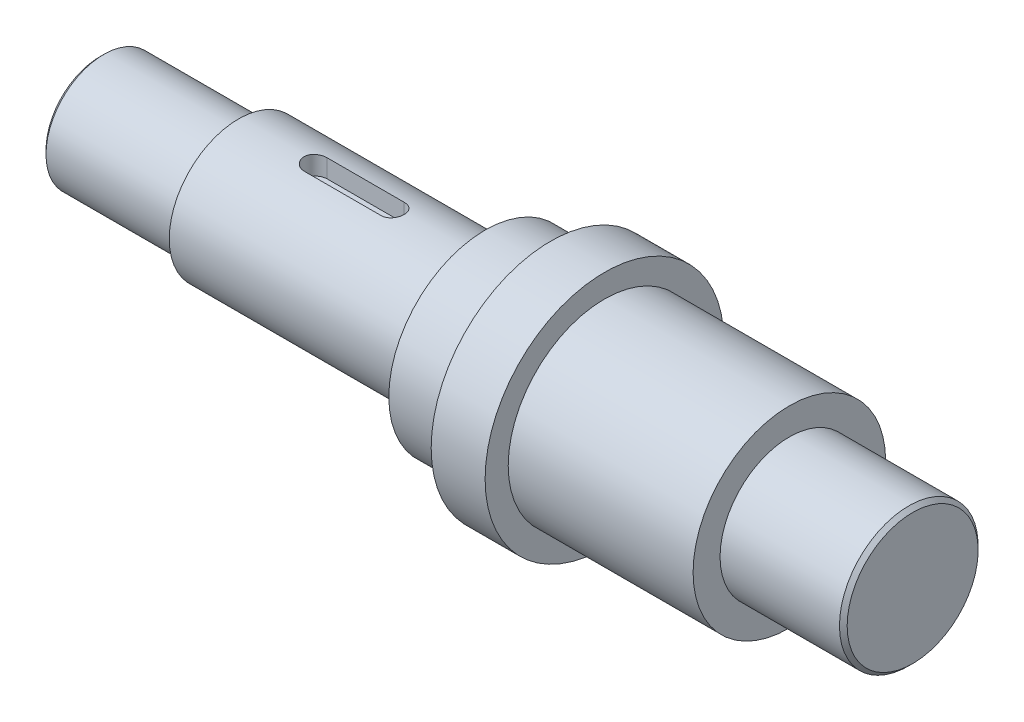
ISO-10303-21;
HEADER;
FILE_DESCRIPTION(('STEP AP214'),'2;1');
FILE_NAME('part.step','',(''),(''),'','','');
FILE_SCHEMA(('AUTOMOTIVE_DESIGN { 1 0 10303 214 1 1 1 1 }'));
ENDSEC;
DATA;
#1=APPLICATION_CONTEXT('core data for automotive mechanical design processes');
#2=APPLICATION_PROTOCOL_DEFINITION('international standard','automotive_design',2000,#1);
#3=PRODUCT_CONTEXT('',#1,'mechanical');
#4=PRODUCT('Part','Part','',(#3));
#5=PRODUCT_RELATED_PRODUCT_CATEGORY('part','',(#4));
#6=PRODUCT_DEFINITION_FORMATION('','',#4);
#7=PRODUCT_DEFINITION_CONTEXT('part definition',#1,'design');
#8=PRODUCT_DEFINITION('design','',#6,#7);
#9=PRODUCT_DEFINITION_SHAPE('','',#8);
#10=(LENGTH_UNIT() NAMED_UNIT(*) SI_UNIT(.MILLI.,.METRE.));
#11=(NAMED_UNIT(*) PLANE_ANGLE_UNIT() SI_UNIT($,.RADIAN.));
#12=(NAMED_UNIT(*) SI_UNIT($,.STERADIAN.) SOLID_ANGLE_UNIT());
#13=UNCERTAINTY_MEASURE_WITH_UNIT(LENGTH_MEASURE(1.E-05),#10,'distance_accuracy_value','');
#14=(GEOMETRIC_REPRESENTATION_CONTEXT(3) GLOBAL_UNCERTAINTY_ASSIGNED_CONTEXT((#13)) GLOBAL_UNIT_ASSIGNED_CONTEXT((#10,
#11,#12)) REPRESENTATION_CONTEXT('',''));
#15=CARTESIAN_POINT('',(0.,0.,0.));
#16=DIRECTION('',(0.,0.,1.));
#17=DIRECTION('',(1.,0.,0.));
#18=AXIS2_PLACEMENT_3D('',#15,#16,#17);
#19=CARTESIAN_POINT('',(0.,0.,0.));
#20=DIRECTION('',(1.,0.,0.));
#21=DIRECTION('',(0.,0.,-1.));
#22=AXIS2_PLACEMENT_3D('',#19,#20,#21);
#23=PLANE('',#22);
#24=CARTESIAN_POINT('',(0.,0.,0.));
#25=DIRECTION('',(-1.,0.,0.));
#26=DIRECTION('',(0.,0.,1.));
#27=AXIS2_PLACEMENT_3D('',#24,#25,#26);
#28=CIRCLE('',#27,7.);
#29=CARTESIAN_POINT('',(0.,0.,7.));
#30=VERTEX_POINT('',#29);
#31=EDGE_CURVE('E170',#30,#30,#28,.T.);
#32=ORIENTED_EDGE('',*,*,#31,.T.);
#33=EDGE_LOOP('',(#32));
#34=FACE_BOUND('',#33,.T.);
#35=ADVANCED_FACE('F40',(#34),#23,.F.);
#36=CARTESIAN_POINT('',(0.5,0.,0.));
#37=DIRECTION('',(1.,0.,0.));
#38=DIRECTION('',(0.,0.,-1.));
#39=AXIS2_PLACEMENT_3D('',#36,#37,#38);
#40=CONICAL_SURFACE('',#39,7.5,0.785398163397448);
#41=ORIENTED_EDGE('',*,*,#31,.F.);
#42=EDGE_LOOP('',(#41));
#43=FACE_BOUND('',#42,.T.);
#44=CARTESIAN_POINT('',(0.5,0.,0.));
#45=DIRECTION('',(-1.,0.,0.));
#46=DIRECTION('',(0.,0.,1.));
#47=AXIS2_PLACEMENT_3D('',#44,#45,#46);
#48=CIRCLE('',#47,7.5);
#49=CARTESIAN_POINT('',(0.5,0.,7.5));
#50=VERTEX_POINT('',#49);
#51=EDGE_CURVE('E166',#50,#50,#48,.T.);
#52=ORIENTED_EDGE('',*,*,#51,.T.);
#53=EDGE_LOOP('',(#52));
#54=FACE_BOUND('',#53,.T.);
#55=ADVANCED_FACE('F251',(#43,#54),#40,.T.);
#56=CARTESIAN_POINT('',(-5.,0.,0.));
#57=DIRECTION('',(-1.,0.,0.));
#58=DIRECTION('',(0.,0.,1.));
#59=AXIS2_PLACEMENT_3D('',#56,#57,#58);
#60=CYLINDRICAL_SURFACE('',#59,7.5);
#61=ORIENTED_EDGE('',*,*,#51,.F.);
#62=EDGE_LOOP('',(#61));
#63=FACE_BOUND('',#62,.T.);
#64=CARTESIAN_POINT('',(18.,0.,0.));
#65=DIRECTION('',(-1.,0.,0.));
#66=DIRECTION('',(0.,0.,1.));
#67=AXIS2_PLACEMENT_3D('',#64,#65,#66);
#68=CIRCLE('',#67,7.5);
#69=CARTESIAN_POINT('',(18.,0.,7.5));
#70=VERTEX_POINT('',#69);
#71=EDGE_CURVE('E162',#70,#70,#68,.T.);
#72=ORIENTED_EDGE('',*,*,#71,.T.);
#73=EDGE_LOOP('',(#72));
#74=FACE_BOUND('',#73,.T.);
#75=ADVANCED_FACE('F256',(#63,#74),#60,.T.);
#76=CARTESIAN_POINT('',(18.,7.5,0.));
#77=DIRECTION('',(1.,0.,0.));
#78=DIRECTION('',(0.,0.,-1.));
#79=AXIS2_PLACEMENT_3D('',#76,#77,#78);
#80=PLANE('',#79);
#81=ORIENTED_EDGE('',*,*,#71,.F.);
#82=EDGE_LOOP('',(#81));
#83=FACE_BOUND('',#82,.T.);
#84=CARTESIAN_POINT('',(18.,0.,0.));
#85=DIRECTION('',(-1.,0.,0.));
#86=DIRECTION('',(0.,0.,1.));
#87=AXIS2_PLACEMENT_3D('',#84,#85,#86);
#88=CIRCLE('',#87,9.);
#89=CARTESIAN_POINT('',(18.,0.,9.));
#90=VERTEX_POINT('',#89);
#91=EDGE_CURVE('E158',#90,#90,#88,.T.);
#92=ORIENTED_EDGE('',*,*,#91,.T.);
#93=EDGE_LOOP('',(#92));
#94=FACE_BOUND('',#93,.T.);
#95=ADVANCED_FACE('F246',(#83,#94),#80,.F.);
#96=CARTESIAN_POINT('',(-5.,0.,0.));
#97=DIRECTION('',(-1.,0.,0.));
#98=DIRECTION('',(0.,0.,1.));
#99=AXIS2_PLACEMENT_3D('',#96,#97,#98);
#100=CYLINDRICAL_SURFACE('',#99,9.);
#101=DIRECTION('',(-1.,0.,0.));
#102=VECTOR('',#101,1.);
#103=CARTESIAN_POINT('',(-5.,8.87411967464942,-1.5));
#104=LINE('',#103,#102);
#105=CARTESIAN_POINT('',(28.,8.87411967464942,-1.5));
#106=VERTEX_POINT('',#105);
#107=CARTESIAN_POINT('',(38.,8.87411967464942,-1.5));
#108=VERTEX_POINT('',#107);
#109=EDGE_CURVE('E11',#106,#108,#104,.F.);
#110=ORIENTED_EDGE('',*,*,#109,.T.);
#111=CARTESIAN_POINT('',(38.,8.87411967464942,-1.5));
#112=CARTESIAN_POINT('',(38.0418886267368,8.87411792615096,-1.50000006904267));
#113=CARTESIAN_POINT('',(38.0837568941764,8.87441664363555,-1.49824423408424));
#114=CARTESIAN_POINT('',(38.1671880147316,8.87559669020086,-1.49124178401098));
#115=CARTESIAN_POINT('',(38.2087508979964,8.8764779609657,-1.4859955183016));
#116=CARTESIAN_POINT('',(38.3324187111013,8.87996319268026,-1.4650822501793));
#117=CARTESIAN_POINT('',(38.4136860590244,8.88340872881371,-1.44424056448389));
#118=CARTESIAN_POINT('',(38.5715048995383,8.89215318116357,-1.38937881365859));
#119=CARTESIAN_POINT('',(38.6480553519947,8.89745250445522,-1.3553558538611));
#120=CARTESIAN_POINT('',(38.7943758990962,8.90930486217545,-1.27511788404052));
#121=CARTESIAN_POINT('',(38.8641459055039,8.91585791291614,-1.22890271538306));
#122=CARTESIAN_POINT('',(38.9955856693389,8.92955048937879,-1.12511491853243));
#123=CARTESIAN_POINT('',(39.0571795627497,8.93669462705947,-1.067446852766));
#124=CARTESIAN_POINT('',(39.1698708804855,8.95072423856692,-0.942589545751882));
#125=CARTESIAN_POINT('',(39.2209666956805,8.95760967260802,-0.875398847552288));
#126=CARTESIAN_POINT('',(39.3114901145867,8.97039460391512,-0.732911677810394));
#127=CARTESIAN_POINT('',(39.3508464693239,8.97628798986086,-0.657569347186731));
#128=CARTESIAN_POINT('',(39.416314112968,8.98637266194558,-0.501232755054783));
#129=CARTESIAN_POINT('',(39.4424270155472,8.99056415544228,-0.420239183500803));
#130=CARTESIAN_POINT('',(39.4804353004737,8.99674037147235,-0.255687212510233));
#131=CARTESIAN_POINT('',(39.492459466049,8.99874507133308,-0.172159321551123));
#132=CARTESIAN_POINT('',(39.5023495005559,9.00039048420494,-0.00424717951710953));
#133=CARTESIAN_POINT('',(39.5002159960254,9.00003130182803,0.0801370334968457));
#134=CARTESIAN_POINT('',(39.4819511620767,8.99700514581231,0.246481577055262));
#135=CARTESIAN_POINT('',(39.465958805302,8.99436108502486,0.328457643451596));
#136=CARTESIAN_POINT('',(39.4206491621663,8.98708784321037,0.488545687130787));
#137=CARTESIAN_POINT('',(39.3913315549357,8.98245861438099,0.5666575713146));
#138=CARTESIAN_POINT('',(39.3200649737103,8.97169609034997,0.717215091914944));
#139=CARTESIAN_POINT('',(39.2780585124891,8.96555597400739,0.789633009039938));
#140=CARTESIAN_POINT('',(39.1826502258389,8.95245416940224,0.926441728607505));
#141=CARTESIAN_POINT('',(39.1292479017721,8.94549244519534,0.990832179604651));
#142=CARTESIAN_POINT('',(39.0118011910669,8.93142258250748,1.1105744410703));
#143=CARTESIAN_POINT('',(38.9476366822349,8.92431368978154,1.16580839419715));
#144=CARTESIAN_POINT('',(38.8108666148998,8.91082953509234,1.26476070651518));
#145=CARTESIAN_POINT('',(38.738258658229,8.90445448258767,1.30847578246262));
#146=CARTESIAN_POINT('',(38.5865158288629,8.89315848740736,1.38317289339947));
#147=CARTESIAN_POINT('',(38.5073701363626,8.88824001960813,1.41413329147723));
#148=CARTESIAN_POINT('',(38.3449554393062,8.88045320186274,1.46224310415678));
#149=CARTESIAN_POINT('',(38.2616927983901,8.87758178752904,1.47941316744192));
#150=CARTESIAN_POINT('',(38.148164121967,8.87530681330251,1.49296191627811));
#151=CARTESIAN_POINT('',(38.1185684117747,8.87486203408182,1.49560229880292));
#152=CARTESIAN_POINT('',(38.0593194494569,8.87426876414454,1.49911904379613));
#153=CARTESIAN_POINT('',(38.0296663784748,8.87411977515142,1.49999837288756));
#154=CARTESIAN_POINT('',(38.,8.87411967464942,1.5));
#155=B_SPLINE_CURVE_WITH_KNOTS('',3,(#111,#112,#113,#114,#115,#116,#117,#118,#119,#120,#121,
#122,#123,#124,#125,#126,#127,#128,#129,#130,#131,#132,#133,#134,#135,#136,#137,#138,#139,#140,
#141,#142,#143,#144,#145,#146,#147,#148,#149,#150,#151,#152,#153,#154),.UNSPECIFIED.,.F.,.F.,(4,
2,2,2,2,2,2,2,2,2,2,2,2,2,2,2,2,2,2,2,2,4),(0.,0.125587759519567,0.251162949115918,
0.501770638983443,0.752433394660611,1.00309941190333,1.25594920935564,1.5088377343858,
1.76323123857547,2.01759373828184,2.26961254331676,2.52162019550984,2.77112965005853,
3.02064511306863,3.27130841381245,3.52198268483706,3.77566792289894,4.0294253912381,
4.28361157608617,4.53741644702515,4.62652585479063,4.71548502456368),.UNSPECIFIED.);
#156=CARTESIAN_POINT('',(38.,8.87411967464942,1.5));
#157=VERTEX_POINT('',#156);
#158=EDGE_CURVE('E174',#108,#157,#155,.T.);
#159=ORIENTED_EDGE('',*,*,#158,.T.);
#160=DIRECTION('',(-1.,0.,0.));
#161=VECTOR('',#160,1.);
#162=CARTESIAN_POINT('',(-5.,8.87411967464942,1.5));
#163=LINE('',#162,#161);
#164=CARTESIAN_POINT('',(28.,8.87411967464942,1.5));
#165=VERTEX_POINT('',#164);
#166=EDGE_CURVE('E48',#157,#165,#163,.T.);
#167=ORIENTED_EDGE('',*,*,#166,.T.);
#168=CARTESIAN_POINT('',(28.,8.87411967464942,1.5));
#169=CARTESIAN_POINT('',(27.9581113732632,8.87411792615096,1.50000006904267));
#170=CARTESIAN_POINT('',(27.9162431058236,8.87441664363556,1.49824423408424));
#171=CARTESIAN_POINT('',(27.8328119852684,8.87559669020086,1.49124178401098));
#172=CARTESIAN_POINT('',(27.7912491020036,8.8764779609657,1.4859955183016));
#173=CARTESIAN_POINT('',(27.6675812888987,8.87996319268026,1.46508225017931));
#174=CARTESIAN_POINT('',(27.5863139409756,8.88340872881371,1.44424056448389));
#175=CARTESIAN_POINT('',(27.4284951004617,8.89215318116357,1.38937881365859));
#176=CARTESIAN_POINT('',(27.3519446480053,8.89745250445522,1.3553558538611));
#177=CARTESIAN_POINT('',(27.2056241009038,8.90930486217545,1.27511788404052));
#178=CARTESIAN_POINT('',(27.1358540944961,8.91585791291613,1.22890271538306));
#179=CARTESIAN_POINT('',(27.0044143306611,8.92955048937879,1.12511491853243));
#180=CARTESIAN_POINT('',(26.9428204372503,8.93669462705947,1.067446852766));
#181=CARTESIAN_POINT('',(26.8301291195145,8.95072423856692,0.942589545751886));
#182=CARTESIAN_POINT('',(26.7790333043195,8.95760967260802,0.875398847552288));
#183=CARTESIAN_POINT('',(26.6885098854133,8.97039460391512,0.732911677810392));
#184=CARTESIAN_POINT('',(26.6491535306761,8.97628798986085,0.65756934718673));
#185=CARTESIAN_POINT('',(26.583685887032,8.98637266194558,0.50123275505478));
#186=CARTESIAN_POINT('',(26.5575729844528,8.99056415544228,0.420239183500798));
#187=CARTESIAN_POINT('',(26.5195646995263,8.99674037147235,0.255687212510226));
#188=CARTESIAN_POINT('',(26.507540533951,8.99874507133308,0.172159321551116));
#189=CARTESIAN_POINT('',(26.4976504994441,9.00039048420494,0.00424717951710302));
#190=CARTESIAN_POINT('',(26.4997840039746,9.00003130182803,-0.0801370334968521));
#191=CARTESIAN_POINT('',(26.5180488379233,8.99700514581231,-0.246481577055268));
#192=CARTESIAN_POINT('',(26.534041194698,8.99436108502486,-0.328457643451602));
#193=CARTESIAN_POINT('',(26.5793508378337,8.98708784321037,-0.48854568713079));
#194=CARTESIAN_POINT('',(26.6086684450643,8.98245861438099,-0.5666575713146));
#195=CARTESIAN_POINT('',(26.6799350262898,8.97169609034997,-0.717215091914944));
#196=CARTESIAN_POINT('',(26.7219414875109,8.96555597400739,-0.78963300903994));
#197=CARTESIAN_POINT('',(26.8173497741611,8.95245416940224,-0.926441728607508));
#198=CARTESIAN_POINT('',(26.8707520982279,8.94549244519534,-0.990832179604651));
#199=CARTESIAN_POINT('',(26.9881988089331,8.93142258250748,-1.1105744410703));
#200=CARTESIAN_POINT('',(27.0523633177651,8.92431368978154,-1.16580839419716));
#201=CARTESIAN_POINT('',(27.1891333851002,8.91082953509234,-1.26476070651519));
#202=CARTESIAN_POINT('',(27.261741341771,8.90445448258767,-1.30847578246262));
#203=CARTESIAN_POINT('',(27.4134841711371,8.89315848740736,-1.38317289339947));
#204=CARTESIAN_POINT('',(27.4926298636374,8.88824001960813,-1.41413329147724));
#205=CARTESIAN_POINT('',(27.6550445606938,8.88045320186274,-1.46224310415679));
#206=CARTESIAN_POINT('',(27.7383072016099,8.87758178752904,-1.47941316744192));
#207=CARTESIAN_POINT('',(27.851835878033,8.87530681330251,-1.49296191627811));
#208=CARTESIAN_POINT('',(27.8814315882253,8.87486203408182,-1.49560229880292));
#209=CARTESIAN_POINT('',(27.9406805505431,8.87426876414454,-1.49911904379613));
#210=CARTESIAN_POINT('',(27.9703336215252,8.87411977515142,-1.49999837288757));
#211=CARTESIAN_POINT('',(28.,8.87411967464942,-1.5));
#212=B_SPLINE_CURVE_WITH_KNOTS('',3,(#168,#169,#170,#171,#172,#173,#174,#175,#176,#177,#178,
#179,#180,#181,#182,#183,#184,#185,#186,#187,#188,#189,#190,#191,#192,#193,#194,#195,#196,#197,
#198,#199,#200,#201,#202,#203,#204,#205,#206,#207,#208,#209,#210,#211),.UNSPECIFIED.,.F.,.F.,(4,
2,2,2,2,2,2,2,2,2,2,2,2,2,2,2,2,2,2,2,2,4),(0.,0.125587759519567,0.251162949115918,
0.501770638983443,0.752433394660604,1.00309941190332,1.25594920935563,1.50883773438579,
1.76323123857546,2.01759373828185,2.26961254331677,2.52162019550984,2.77112965005853,
3.02064511306863,3.27130841381245,3.52198268483706,3.77566792289895,4.0294253912381,
4.28361157608618,4.53741644702515,4.62652585479064,4.71548502456368),.UNSPECIFIED.);
#213=EDGE_CURVE('E55',#165,#106,#212,.T.);
#214=ORIENTED_EDGE('',*,*,#213,.T.);
#215=EDGE_LOOP('',(#110,#159,#167,#214));
#216=FACE_BOUND('',#215,.T.);
#217=ORIENTED_EDGE('',*,*,#91,.F.);
#218=EDGE_LOOP('',(#217));
#219=FACE_BOUND('',#218,.T.);
#220=CARTESIAN_POINT('',(50.,0.,0.));
#221=DIRECTION('',(-1.,0.,0.));
#222=DIRECTION('',(0.,0.,1.));
#223=AXIS2_PLACEMENT_3D('',#220,#221,#222);
#224=CIRCLE('',#223,9.);
#225=CARTESIAN_POINT('',(50.,0.,9.));
#226=VERTEX_POINT('',#225);
#227=EDGE_CURVE('E154',#226,#226,#224,.T.);
#228=ORIENTED_EDGE('',*,*,#227,.T.);
#229=EDGE_LOOP('',(#228));
#230=FACE_BOUND('',#229,.T.);
#231=ADVANCED_FACE('F189',(#216,#219,#230),#100,.T.);
#232=CARTESIAN_POINT('',(50.,9.,0.));
#233=DIRECTION('',(1.,0.,0.));
#234=DIRECTION('',(0.,0.,-1.));
#235=AXIS2_PLACEMENT_3D('',#232,#233,#234);
#236=PLANE('',#235);
#237=ORIENTED_EDGE('',*,*,#227,.F.);
#238=EDGE_LOOP('',(#237));
#239=FACE_BOUND('',#238,.T.);
#240=CARTESIAN_POINT('',(50.,0.,0.));
#241=DIRECTION('',(-1.,0.,0.));
#242=DIRECTION('',(0.,0.,1.));
#243=AXIS2_PLACEMENT_3D('',#240,#241,#242);
#244=CIRCLE('',#243,12.5);
#245=CARTESIAN_POINT('',(50.,0.,12.5));
#246=VERTEX_POINT('',#245);
#247=EDGE_CURVE('E150',#246,#246,#244,.T.);
#248=ORIENTED_EDGE('',*,*,#247,.T.);
#249=EDGE_LOOP('',(#248));
#250=FACE_BOUND('',#249,.T.);
#251=ADVANCED_FACE('F239',(#239,#250),#236,.F.);
#252=CARTESIAN_POINT('',(-5.,0.,0.));
#253=DIRECTION('',(-1.,0.,0.));
#254=DIRECTION('',(0.,0.,1.));
#255=AXIS2_PLACEMENT_3D('',#252,#253,#254);
#256=CYLINDRICAL_SURFACE('',#255,12.5);
#257=ORIENTED_EDGE('',*,*,#247,.F.);
#258=EDGE_LOOP('',(#257));
#259=FACE_BOUND('',#258,.T.);
#260=CARTESIAN_POINT('',(58.5,0.,0.));
#261=DIRECTION('',(-1.,0.,0.));
#262=DIRECTION('',(0.,0.,1.));
#263=AXIS2_PLACEMENT_3D('',#260,#261,#262);
#264=CIRCLE('',#263,12.5);
#265=CARTESIAN_POINT('',(58.5,0.,12.5));
#266=VERTEX_POINT('',#265);
#267=EDGE_CURVE('E146',#266,#266,#264,.T.);
#268=ORIENTED_EDGE('',*,*,#267,.T.);
#269=EDGE_LOOP('',(#268));
#270=FACE_BOUND('',#269,.T.);
#271=ADVANCED_FACE('F236',(#259,#270),#256,.T.);
#272=CARTESIAN_POINT('',(58.5,12.5,0.));
#273=DIRECTION('',(1.,0.,0.));
#274=DIRECTION('',(0.,0.,-1.));
#275=AXIS2_PLACEMENT_3D('',#272,#273,#274);
#276=PLANE('',#275);
#277=ORIENTED_EDGE('',*,*,#267,.F.);
#278=EDGE_LOOP('',(#277));
#279=FACE_BOUND('',#278,.T.);
#280=CARTESIAN_POINT('',(58.5,0.,0.));
#281=DIRECTION('',(-1.,0.,0.));
#282=DIRECTION('',(0.,0.,1.));
#283=AXIS2_PLACEMENT_3D('',#280,#281,#282);
#284=CIRCLE('',#283,15.5);
#285=CARTESIAN_POINT('',(58.5,0.,15.5));
#286=VERTEX_POINT('',#285);
#287=EDGE_CURVE('E142',#286,#286,#284,.T.);
#288=ORIENTED_EDGE('',*,*,#287,.T.);
#289=EDGE_LOOP('',(#288));
#290=FACE_BOUND('',#289,.T.);
#291=ADVANCED_FACE('F232',(#279,#290),#276,.F.);
#292=CARTESIAN_POINT('',(-5.,0.,0.));
#293=DIRECTION('',(-1.,0.,0.));
#294=DIRECTION('',(0.,0.,1.));
#295=AXIS2_PLACEMENT_3D('',#292,#293,#294);
#296=CYLINDRICAL_SURFACE('',#295,15.5);
#297=ORIENTED_EDGE('',*,*,#287,.F.);
#298=EDGE_LOOP('',(#297));
#299=FACE_BOUND('',#298,.T.);
#300=CARTESIAN_POINT('',(65.5,0.,0.));
#301=DIRECTION('',(-1.,0.,0.));
#302=DIRECTION('',(0.,0.,1.));
#303=AXIS2_PLACEMENT_3D('',#300,#301,#302);
#304=CIRCLE('',#303,15.5);
#305=CARTESIAN_POINT('',(65.5,0.,15.5));
#306=VERTEX_POINT('',#305);
#307=EDGE_CURVE('E138',#306,#306,#304,.T.);
#308=ORIENTED_EDGE('',*,*,#307,.T.);
#309=EDGE_LOOP('',(#308));
#310=FACE_BOUND('',#309,.T.);
#311=ADVANCED_FACE('F228',(#299,#310),#296,.T.);
#312=CARTESIAN_POINT('',(65.5,15.5,0.));
#313=DIRECTION('',(-1.,0.,0.));
#314=DIRECTION('',(0.,0.,1.));
#315=AXIS2_PLACEMENT_3D('',#312,#313,#314);
#316=PLANE('',#315);
#317=ORIENTED_EDGE('',*,*,#307,.F.);
#318=EDGE_LOOP('',(#317));
#319=FACE_BOUND('',#318,.T.);
#320=CARTESIAN_POINT('',(65.5,0.,0.));
#321=DIRECTION('',(-1.,0.,0.));
#322=DIRECTION('',(0.,0.,1.));
#323=AXIS2_PLACEMENT_3D('',#320,#321,#322);
#324=CIRCLE('',#323,12.5);
#325=CARTESIAN_POINT('',(65.5,0.,12.5));
#326=VERTEX_POINT('',#325);
#327=EDGE_CURVE('E134',#326,#326,#324,.T.);
#328=ORIENTED_EDGE('',*,*,#327,.T.);
#329=EDGE_LOOP('',(#328));
#330=FACE_BOUND('',#329,.T.);
#331=ADVANCED_FACE('F224',(#319,#330),#316,.F.);
#332=CARTESIAN_POINT('',(-5.,0.,0.));
#333=DIRECTION('',(-1.,0.,0.));
#334=DIRECTION('',(0.,0.,1.));
#335=AXIS2_PLACEMENT_3D('',#332,#333,#334);
#336=CYLINDRICAL_SURFACE('',#335,12.5);
#337=ORIENTED_EDGE('',*,*,#327,.F.);
#338=EDGE_LOOP('',(#337));
#339=FACE_BOUND('',#338,.T.);
#340=CARTESIAN_POINT('',(89.5,0.,0.));
#341=DIRECTION('',(-1.,0.,0.));
#342=DIRECTION('',(0.,0.,1.));
#343=AXIS2_PLACEMENT_3D('',#340,#341,#342);
#344=CIRCLE('',#343,12.5);
#345=CARTESIAN_POINT('',(89.5,0.,12.5));
#346=VERTEX_POINT('',#345);
#347=EDGE_CURVE('E130',#346,#346,#344,.T.);
#348=ORIENTED_EDGE('',*,*,#347,.T.);
#349=EDGE_LOOP('',(#348));
#350=FACE_BOUND('',#349,.T.);
#351=ADVANCED_FACE('F220',(#339,#350),#336,.T.);
#352=CARTESIAN_POINT('',(89.5,12.5,0.));
#353=DIRECTION('',(-1.,0.,0.));
#354=DIRECTION('',(0.,0.,1.));
#355=AXIS2_PLACEMENT_3D('',#352,#353,#354);
#356=PLANE('',#355);
#357=ORIENTED_EDGE('',*,*,#347,.F.);
#358=EDGE_LOOP('',(#357));
#359=FACE_BOUND('',#358,.T.);
#360=CARTESIAN_POINT('',(89.5,0.,0.));
#361=DIRECTION('',(-1.,0.,0.));
#362=DIRECTION('',(0.,0.,1.));
#363=AXIS2_PLACEMENT_3D('',#360,#361,#362);
#364=CIRCLE('',#363,9.);
#365=CARTESIAN_POINT('',(89.5,0.,9.));
#366=VERTEX_POINT('',#365);
#367=EDGE_CURVE('E126',#366,#366,#364,.T.);
#368=ORIENTED_EDGE('',*,*,#367,.T.);
#369=EDGE_LOOP('',(#368));
#370=FACE_BOUND('',#369,.T.);
#371=ADVANCED_FACE('F216',(#359,#370),#356,.F.);
#372=CARTESIAN_POINT('',(-5.,0.,0.));
#373=DIRECTION('',(-1.,0.,0.));
#374=DIRECTION('',(0.,0.,1.));
#375=AXIS2_PLACEMENT_3D('',#372,#373,#374);
#376=CYLINDRICAL_SURFACE('',#375,9.);
#377=ORIENTED_EDGE('',*,*,#367,.F.);
#378=EDGE_LOOP('',(#377));
#379=FACE_BOUND('',#378,.T.);
#380=CARTESIAN_POINT('',(105.,0.,0.));
#381=DIRECTION('',(-1.,0.,0.));
#382=DIRECTION('',(0.,0.,1.));
#383=AXIS2_PLACEMENT_3D('',#380,#381,#382);
#384=CIRCLE('',#383,9.);
#385=CARTESIAN_POINT('',(105.,0.,9.));
#386=VERTEX_POINT('',#385);
#387=EDGE_CURVE('E122',#386,#386,#384,.T.);
#388=ORIENTED_EDGE('',*,*,#387,.T.);
#389=EDGE_LOOP('',(#388));
#390=FACE_BOUND('',#389,.T.);
#391=ADVANCED_FACE('F212',(#379,#390),#376,.T.);
#392=CARTESIAN_POINT('',(105.5,0.,0.));
#393=DIRECTION('',(-1.,0.,0.));
#394=DIRECTION('',(0.,0.,1.));
#395=AXIS2_PLACEMENT_3D('',#392,#393,#394);
#396=CONICAL_SURFACE('',#395,8.5,0.785398163397447);
#397=ORIENTED_EDGE('',*,*,#387,.F.);
#398=EDGE_LOOP('',(#397));
#399=FACE_BOUND('',#398,.T.);
#400=CARTESIAN_POINT('',(105.5,0.,0.));
#401=DIRECTION('',(-1.,0.,0.));
#402=DIRECTION('',(0.,0.,1.));
#403=AXIS2_PLACEMENT_3D('',#400,#401,#402);
#404=CIRCLE('',#403,8.5);
#405=CARTESIAN_POINT('',(105.5,0.,8.5));
#406=VERTEX_POINT('',#405);
#407=EDGE_CURVE('E113',#406,#406,#404,.T.);
#408=ORIENTED_EDGE('',*,*,#407,.T.);
#409=EDGE_LOOP('',(#408));
#410=FACE_BOUND('',#409,.T.);
#411=ADVANCED_FACE('F208',(#399,#410),#396,.T.);
#412=CARTESIAN_POINT('',(105.5,8.5,0.));
#413=DIRECTION('',(-1.,0.,0.));
#414=DIRECTION('',(0.,0.,1.));
#415=AXIS2_PLACEMENT_3D('',#412,#413,#414);
#416=PLANE('',#415);
#417=ORIENTED_EDGE('',*,*,#407,.F.);
#418=EDGE_LOOP('',(#417));
#419=FACE_BOUND('',#418,.T.);
#420=ADVANCED_FACE('F205',(#419),#416,.F.);
#421=CARTESIAN_POINT('',(28.,6.5,0.));
#422=DIRECTION('',(0.,1.,0.));
#423=DIRECTION('',(0.,0.,1.));
#424=AXIS2_PLACEMENT_3D('',#421,#422,#423);
#425=CYLINDRICAL_SURFACE('',#424,1.5);
#426=DIRECTION('',(0.,1.,0.));
#427=VECTOR('',#426,1.);
#428=CARTESIAN_POINT('',(28.,6.5,1.5));
#429=LINE('',#428,#427);
#430=CARTESIAN_POINT('',(28.,6.5,1.5));
#431=VERTEX_POINT('',#430);
#432=EDGE_CURVE('E78',#431,#165,#429,.T.);
#433=ORIENTED_EDGE('',*,*,#432,.F.);
#434=CARTESIAN_POINT('',(28.,6.5,0.));
#435=DIRECTION('',(0.,1.,0.));
#436=DIRECTION('',(0.,0.,1.));
#437=AXIS2_PLACEMENT_3D('',#434,#435,#436);
#438=CIRCLE('',#437,1.5);
#439=CARTESIAN_POINT('',(28.,6.5,-1.5));
#440=VERTEX_POINT('',#439);
#441=EDGE_CURVE('E82',#440,#431,#438,.T.);
#442=ORIENTED_EDGE('',*,*,#441,.F.);
#443=DIRECTION('',(0.,1.,0.));
#444=VECTOR('',#443,1.);
#445=CARTESIAN_POINT('',(28.,6.5,-1.5));
#446=LINE('',#445,#444);
#447=EDGE_CURVE('E110',#440,#106,#446,.T.);
#448=ORIENTED_EDGE('',*,*,#447,.T.);
#449=ORIENTED_EDGE('',*,*,#213,.F.);
#450=EDGE_LOOP('',(#433,#442,#448,#449));
#451=FACE_BOUND('',#450,.T.);
#452=ADVANCED_FACE('F80',(#451),#425,.F.);
#453=CARTESIAN_POINT('',(28.,6.5,-1.5));
#454=DIRECTION('',(0.,0.,-1.));
#455=DIRECTION('',(-1.,0.,0.));
#456=AXIS2_PLACEMENT_3D('',#453,#454,#455);
#457=PLANE('',#456);
#458=ORIENTED_EDGE('',*,*,#447,.F.);
#459=DIRECTION('',(-1.,0.,0.));
#460=VECTOR('',#459,1.);
#461=CARTESIAN_POINT('',(28.,6.5,-1.5));
#462=LINE('',#461,#460);
#463=CARTESIAN_POINT('',(38.,6.5,-1.5));
#464=VERTEX_POINT('',#463);
#465=EDGE_CURVE('E88',#464,#440,#462,.T.);
#466=ORIENTED_EDGE('',*,*,#465,.F.);
#467=DIRECTION('',(0.,1.,0.));
#468=VECTOR('',#467,1.);
#469=CARTESIAN_POINT('',(38.,6.5,-1.5));
#470=LINE('',#469,#468);
#471=EDGE_CURVE('E114',#464,#108,#470,.T.);
#472=ORIENTED_EDGE('',*,*,#471,.T.);
#473=ORIENTED_EDGE('',*,*,#109,.F.);
#474=EDGE_LOOP('',(#458,#466,#472,#473));
#475=FACE_BOUND('',#474,.T.);
#476=ADVANCED_FACE('F198',(#475),#457,.F.);
#477=CARTESIAN_POINT('',(38.,6.5,0.));
#478=DIRECTION('',(0.,1.,0.));
#479=DIRECTION('',(0.,0.,1.));
#480=AXIS2_PLACEMENT_3D('',#477,#478,#479);
#481=CYLINDRICAL_SURFACE('',#480,1.5);
#482=ORIENTED_EDGE('',*,*,#471,.F.);
#483=CARTESIAN_POINT('',(38.,6.5,0.));
#484=DIRECTION('',(0.,1.,0.));
#485=DIRECTION('',(0.,0.,1.));
#486=AXIS2_PLACEMENT_3D('',#483,#484,#485);
#487=CIRCLE('',#486,1.5);
#488=CARTESIAN_POINT('',(38.,6.5,1.5));
#489=VERTEX_POINT('',#488);
#490=EDGE_CURVE('E98',#489,#464,#487,.T.);
#491=ORIENTED_EDGE('',*,*,#490,.F.);
#492=DIRECTION('',(0.,1.,0.));
#493=VECTOR('',#492,1.);
#494=CARTESIAN_POINT('',(38.,6.5,1.5));
#495=LINE('',#494,#493);
#496=EDGE_CURVE('E87',#489,#157,#495,.T.);
#497=ORIENTED_EDGE('',*,*,#496,.T.);
#498=ORIENTED_EDGE('',*,*,#158,.F.);
#499=EDGE_LOOP('',(#482,#491,#497,#498));
#500=FACE_BOUND('',#499,.T.);
#501=ADVANCED_FACE('F193',(#500),#481,.F.);
#502=CARTESIAN_POINT('',(28.,6.5,1.5));
#503=DIRECTION('',(0.,0.,1.));
#504=DIRECTION('',(1.,0.,0.));
#505=AXIS2_PLACEMENT_3D('',#502,#503,#504);
#506=PLANE('',#505);
#507=ORIENTED_EDGE('',*,*,#496,.F.);
#508=DIRECTION('',(1.,0.,0.));
#509=VECTOR('',#508,1.);
#510=CARTESIAN_POINT('',(28.,6.5,1.5));
#511=LINE('',#510,#509);
#512=EDGE_CURVE('E91',#431,#489,#511,.T.);
#513=ORIENTED_EDGE('',*,*,#512,.F.);
#514=ORIENTED_EDGE('',*,*,#432,.T.);
#515=ORIENTED_EDGE('',*,*,#166,.F.);
#516=EDGE_LOOP('',(#507,#513,#514,#515));
#517=FACE_BOUND('',#516,.T.);
#518=ADVANCED_FACE('F92',(#517),#506,.F.);
#519=CARTESIAN_POINT('',(28.,6.5,0.));
#520=DIRECTION('',(0.,1.,0.));
#521=DIRECTION('',(0.,0.,1.));
#522=AXIS2_PLACEMENT_3D('',#519,#520,#521);
#523=PLANE('',#522);
#524=ORIENTED_EDGE('',*,*,#441,.T.);
#525=ORIENTED_EDGE('',*,*,#512,.T.);
#526=ORIENTED_EDGE('',*,*,#490,.T.);
#527=ORIENTED_EDGE('',*,*,#465,.T.);
#528=EDGE_LOOP('',(#524,#525,#526,#527));
#529=FACE_BOUND('',#528,.T.);
#530=ADVANCED_FACE('F100',(#529),#523,.T.);
#531=CLOSED_SHELL('',(#35,#55,#75,#95,#231,#251,#271,#291,#311,#331,#351,#371,#391,#411,#420,
#452,#476,#501,#518,#530));
#532=MANIFOLD_SOLID_BREP('B2',#531);
#533=ADVANCED_BREP_SHAPE_REPRESENTATION('',(#18,#532),#14);
#534=SHAPE_DEFINITION_REPRESENTATION(#9,#533);
ENDSEC;
END-ISO-10303-21;
